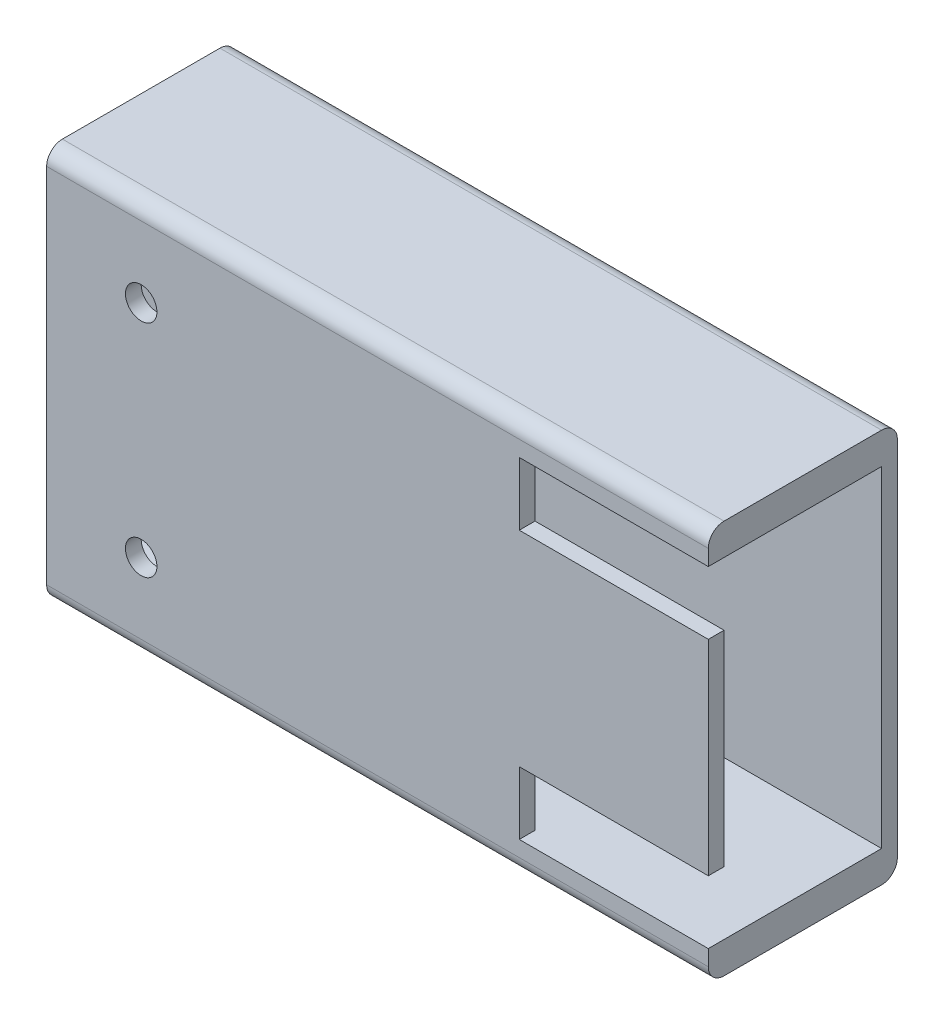
ISO-10303-21;
HEADER;
FILE_DESCRIPTION(('STEP AP214'),'2;1');
FILE_NAME('part.step','',(''),(''),'','','');
FILE_SCHEMA(('AUTOMOTIVE_DESIGN { 1 0 10303 214 1 1 1 1 }'));
ENDSEC;
DATA;
#1=APPLICATION_CONTEXT('core data for automotive mechanical design processes');
#2=APPLICATION_PROTOCOL_DEFINITION('international standard','automotive_design',2000,#1);
#3=PRODUCT_CONTEXT('',#1,'mechanical');
#4=PRODUCT('Part','Part','',(#3));
#5=PRODUCT_RELATED_PRODUCT_CATEGORY('part','',(#4));
#6=PRODUCT_DEFINITION_FORMATION('','',#4);
#7=PRODUCT_DEFINITION_CONTEXT('part definition',#1,'design');
#8=PRODUCT_DEFINITION('design','',#6,#7);
#9=PRODUCT_DEFINITION_SHAPE('','',#8);
#10=(LENGTH_UNIT() NAMED_UNIT(*) SI_UNIT(.MILLI.,.METRE.));
#11=(NAMED_UNIT(*) PLANE_ANGLE_UNIT() SI_UNIT($,.RADIAN.));
#12=(NAMED_UNIT(*) SI_UNIT($,.STERADIAN.) SOLID_ANGLE_UNIT());
#13=UNCERTAINTY_MEASURE_WITH_UNIT(LENGTH_MEASURE(1.E-05),#10,'distance_accuracy_value','');
#14=(GEOMETRIC_REPRESENTATION_CONTEXT(3) GLOBAL_UNCERTAINTY_ASSIGNED_CONTEXT((#13)) GLOBAL_UNIT_ASSIGNED_CONTEXT((#10,
#11,#12)) REPRESENTATION_CONTEXT('',''));
#15=CARTESIAN_POINT('',(0.,0.,0.));
#16=DIRECTION('',(0.,0.,1.));
#17=DIRECTION('',(1.,0.,0.));
#18=AXIS2_PLACEMENT_3D('',#15,#16,#17);
#19=CARTESIAN_POINT('',(21.,12.5,12.));
#20=DIRECTION('',(-1.,0.,0.));
#21=DIRECTION('',(0.,0.,1.));
#22=AXIS2_PLACEMENT_3D('',#19,#20,#21);
#23=PLANE('',#22);
#24=DIRECTION('',(0.,0.,-1.));
#25=VECTOR('',#24,1.);
#26=CARTESIAN_POINT('',(21.,-12.5,12.));
#27=LINE('',#26,#25);
#28=CARTESIAN_POINT('',(21.,-12.5,11.));
#29=VERTEX_POINT('',#28);
#30=CARTESIAN_POINT('',(21.,-12.5,1.));
#31=VERTEX_POINT('',#30);
#32=EDGE_CURVE('E250',#29,#31,#27,.T.);
#33=ORIENTED_EDGE('',*,*,#32,.T.);
#34=CARTESIAN_POINT('',(21.,-11.5,1.));
#35=DIRECTION('',(-1.,0.,0.));
#36=DIRECTION('',(0.,0.,1.));
#37=AXIS2_PLACEMENT_3D('',#34,#35,#36);
#38=CIRCLE('',#37,1.);
#39=CARTESIAN_POINT('',(21.,-11.5,0.));
#40=VERTEX_POINT('',#39);
#41=EDGE_CURVE('E309',#31,#40,#38,.F.);
#42=ORIENTED_EDGE('',*,*,#41,.T.);
#43=DIRECTION('',(0.,1.,0.));
#44=VECTOR('',#43,1.);
#45=CARTESIAN_POINT('',(21.,12.5,0.));
#46=LINE('',#45,#44);
#47=CARTESIAN_POINT('',(21.,11.5,0.));
#48=VERTEX_POINT('',#47);
#49=EDGE_CURVE('E242',#40,#48,#46,.T.);
#50=ORIENTED_EDGE('',*,*,#49,.T.);
#51=CARTESIAN_POINT('',(21.,11.5,1.));
#52=DIRECTION('',(-1.,0.,0.));
#53=DIRECTION('',(0.,0.,1.));
#54=AXIS2_PLACEMENT_3D('',#51,#52,#53);
#55=CIRCLE('',#54,1.);
#56=CARTESIAN_POINT('',(21.,12.5,1.));
#57=VERTEX_POINT('',#56);
#58=EDGE_CURVE('E303',#48,#57,#55,.F.);
#59=ORIENTED_EDGE('',*,*,#58,.T.);
#60=DIRECTION('',(0.,0.,-1.));
#61=VECTOR('',#60,1.);
#62=CARTESIAN_POINT('',(21.,12.5,12.));
#63=LINE('',#62,#61);
#64=CARTESIAN_POINT('',(21.,12.5,11.));
#65=VERTEX_POINT('',#64);
#66=EDGE_CURVE('E232',#65,#57,#63,.T.);
#67=ORIENTED_EDGE('',*,*,#66,.F.);
#68=CARTESIAN_POINT('',(21.,11.5,11.));
#69=DIRECTION('',(-1.,0.,0.));
#70=DIRECTION('',(0.,0.,1.));
#71=AXIS2_PLACEMENT_3D('',#68,#69,#70);
#72=CIRCLE('',#71,1.);
#73=CARTESIAN_POINT('',(21.,11.5,12.));
#74=VERTEX_POINT('',#73);
#75=EDGE_CURVE('E300',#65,#74,#72,.F.);
#76=ORIENTED_EDGE('',*,*,#75,.T.);
#77=DIRECTION('',(0.,1.,0.));
#78=VECTOR('',#77,1.);
#79=CARTESIAN_POINT('',(21.,12.5,12.));
#80=LINE('',#79,#78);
#81=CARTESIAN_POINT('',(21.,10.5,12.));
#82=VERTEX_POINT('',#81);
#83=EDGE_CURVE('E228',#82,#74,#80,.T.);
#84=ORIENTED_EDGE('',*,*,#83,.F.);
#85=DIRECTION('',(0.,0.,1.));
#86=VECTOR('',#85,1.);
#87=CARTESIAN_POINT('',(21.,10.5,11.));
#88=LINE('',#87,#86);
#89=CARTESIAN_POINT('',(21.,10.5,1.));
#90=VERTEX_POINT('',#89);
#91=EDGE_CURVE('E384',#90,#82,#88,.T.);
#92=ORIENTED_EDGE('',*,*,#91,.F.);
#93=DIRECTION('',(0.,1.,0.));
#94=VECTOR('',#93,1.);
#95=CARTESIAN_POINT('',(21.,10.5,1.));
#96=LINE('',#95,#94);
#97=CARTESIAN_POINT('',(21.,-10.5,0.999999999999998));
#98=VERTEX_POINT('',#97);
#99=EDGE_CURVE('E386',#98,#90,#96,.T.);
#100=ORIENTED_EDGE('',*,*,#99,.F.);
#101=DIRECTION('',(0.,0.,-1.));
#102=VECTOR('',#101,1.);
#103=CARTESIAN_POINT('',(21.,-10.5,11.));
#104=LINE('',#103,#102);
#105=CARTESIAN_POINT('',(21.,-10.5,12.));
#106=VERTEX_POINT('',#105);
#107=EDGE_CURVE('E390',#106,#98,#104,.T.);
#108=ORIENTED_EDGE('',*,*,#107,.F.);
#109=CARTESIAN_POINT('',(21.,-11.5,12.));
#110=VERTEX_POINT('',#109);
#111=EDGE_CURVE('E227',#110,#106,#80,.T.);
#112=ORIENTED_EDGE('',*,*,#111,.F.);
#113=CARTESIAN_POINT('',(21.,-11.5,11.));
#114=DIRECTION('',(-1.,0.,0.));
#115=DIRECTION('',(0.,0.,1.));
#116=AXIS2_PLACEMENT_3D('',#113,#114,#115);
#117=CIRCLE('',#116,1.);
#118=EDGE_CURVE('E306',#110,#29,#117,.F.);
#119=ORIENTED_EDGE('',*,*,#118,.T.);
#120=EDGE_LOOP('',(#33,#42,#50,#59,#67,#76,#84,#92,#100,#108,#112,#119));
#121=FACE_BOUND('',#120,.T.);
#122=ADVANCED_FACE('F45',(#121),#23,.F.);
#123=CARTESIAN_POINT('',(-21.,12.5,12.));
#124=DIRECTION('',(0.,-1.,0.));
#125=DIRECTION('',(0.,0.,-1.));
#126=AXIS2_PLACEMENT_3D('',#123,#124,#125);
#127=PLANE('',#126);
#128=ORIENTED_EDGE('',*,*,#66,.T.);
#129=DIRECTION('',(-1.,0.,0.));
#130=VECTOR('',#129,1.);
#131=CARTESIAN_POINT('',(-21.,12.5,1.));
#132=LINE('',#131,#130);
#133=CARTESIAN_POINT('',(-21.,12.5,1.));
#134=VERTEX_POINT('',#133);
#135=EDGE_CURVE('E11',#57,#134,#132,.T.);
#136=ORIENTED_EDGE('',*,*,#135,.T.);
#137=DIRECTION('',(0.,0.,-1.));
#138=VECTOR('',#137,1.);
#139=CARTESIAN_POINT('',(-21.,12.5,12.));
#140=LINE('',#139,#138);
#141=CARTESIAN_POINT('',(-21.,12.5,11.));
#142=VERTEX_POINT('',#141);
#143=EDGE_CURVE('E258',#142,#134,#140,.T.);
#144=ORIENTED_EDGE('',*,*,#143,.F.);
#145=DIRECTION('',(-1.,0.,0.));
#146=VECTOR('',#145,1.);
#147=CARTESIAN_POINT('',(-21.,12.5,11.));
#148=LINE('',#147,#146);
#149=EDGE_CURVE('E54',#142,#65,#148,.F.);
#150=ORIENTED_EDGE('',*,*,#149,.T.);
#151=EDGE_LOOP('',(#128,#136,#144,#150));
#152=FACE_BOUND('',#151,.T.);
#153=ADVANCED_FACE('F339',(#152),#127,.F.);
#154=CARTESIAN_POINT('',(-21.,12.5,12.));
#155=DIRECTION('',(1.,0.,0.));
#156=DIRECTION('',(0.,0.,-1.));
#157=AXIS2_PLACEMENT_3D('',#154,#155,#156);
#158=PLANE('',#157);
#159=DIRECTION('',(0.,0.,1.));
#160=VECTOR('',#159,1.);
#161=CARTESIAN_POINT('',(-21.,5.,12.));
#162=LINE('',#161,#160);
#163=CARTESIAN_POINT('',(-21.,5.,6.));
#164=VERTEX_POINT('',#163);
#165=CARTESIAN_POINT('',(-21.,5.,11.));
#166=VERTEX_POINT('',#165);
#167=EDGE_CURVE('E269',#164,#166,#162,.T.);
#168=ORIENTED_EDGE('',*,*,#167,.T.);
#169=DIRECTION('',(0.,-1.,0.));
#170=VECTOR('',#169,1.);
#171=CARTESIAN_POINT('',(-21.,12.5,11.));
#172=LINE('',#171,#170);
#173=CARTESIAN_POINT('',(-21.,-5.,11.));
#174=VERTEX_POINT('',#173);
#175=EDGE_CURVE('E273',#166,#174,#172,.T.);
#176=ORIENTED_EDGE('',*,*,#175,.T.);
#177=DIRECTION('',(0.,0.,-1.));
#178=VECTOR('',#177,1.);
#179=CARTESIAN_POINT('',(-21.,-5.,12.));
#180=LINE('',#179,#178);
#181=CARTESIAN_POINT('',(-21.,-5.,6.));
#182=VERTEX_POINT('',#181);
#183=EDGE_CURVE('E261',#174,#182,#180,.T.);
#184=ORIENTED_EDGE('',*,*,#183,.T.);
#185=DIRECTION('',(0.,1.,0.));
#186=VECTOR('',#185,1.);
#187=CARTESIAN_POINT('',(-21.,12.5,6.));
#188=LINE('',#187,#186);
#189=EDGE_CURVE('E265',#182,#164,#188,.T.);
#190=ORIENTED_EDGE('',*,*,#189,.T.);
#191=EDGE_LOOP('',(#168,#176,#184,#190));
#192=FACE_BOUND('',#191,.T.);
#193=DIRECTION('',(0.,-1.,0.));
#194=VECTOR('',#193,1.);
#195=CARTESIAN_POINT('',(-21.,12.5,0.));
#196=LINE('',#195,#194);
#197=CARTESIAN_POINT('',(-21.,11.5,0.));
#198=VERTEX_POINT('',#197);
#199=CARTESIAN_POINT('',(-21.,-11.5,0.));
#200=VERTEX_POINT('',#199);
#201=EDGE_CURVE('E238',#198,#200,#196,.T.);
#202=ORIENTED_EDGE('',*,*,#201,.T.);
#203=CARTESIAN_POINT('',(-21.,-11.5,1.));
#204=DIRECTION('',(1.,0.,0.));
#205=DIRECTION('',(0.,0.,-1.));
#206=AXIS2_PLACEMENT_3D('',#203,#204,#205);
#207=CIRCLE('',#206,1.);
#208=CARTESIAN_POINT('',(-21.,-12.5,1.));
#209=VERTEX_POINT('',#208);
#210=EDGE_CURVE('E325',#200,#209,#207,.F.);
#211=ORIENTED_EDGE('',*,*,#210,.T.);
#212=DIRECTION('',(0.,0.,-1.));
#213=VECTOR('',#212,1.);
#214=CARTESIAN_POINT('',(-21.,-12.5,12.));
#215=LINE('',#214,#213);
#216=CARTESIAN_POINT('',(-21.,-12.5,11.));
#217=VERTEX_POINT('',#216);
#218=EDGE_CURVE('E254',#217,#209,#215,.T.);
#219=ORIENTED_EDGE('',*,*,#218,.F.);
#220=CARTESIAN_POINT('',(-21.,-11.5,11.));
#221=DIRECTION('',(1.,0.,0.));
#222=DIRECTION('',(0.,0.,-1.));
#223=AXIS2_PLACEMENT_3D('',#220,#221,#222);
#224=CIRCLE('',#223,1.);
#225=CARTESIAN_POINT('',(-21.,-11.5,12.));
#226=VERTEX_POINT('',#225);
#227=EDGE_CURVE('E322',#217,#226,#224,.F.);
#228=ORIENTED_EDGE('',*,*,#227,.T.);
#229=DIRECTION('',(0.,-1.,0.));
#230=VECTOR('',#229,1.);
#231=CARTESIAN_POINT('',(-21.,12.5,12.));
#232=LINE('',#231,#230);
#233=CARTESIAN_POINT('',(-21.,11.5,12.));
#234=VERTEX_POINT('',#233);
#235=EDGE_CURVE('E234',#234,#226,#232,.T.);
#236=ORIENTED_EDGE('',*,*,#235,.F.);
#237=CARTESIAN_POINT('',(-21.,11.5,11.));
#238=DIRECTION('',(1.,0.,0.));
#239=DIRECTION('',(0.,0.,-1.));
#240=AXIS2_PLACEMENT_3D('',#237,#238,#239);
#241=CIRCLE('',#240,1.);
#242=EDGE_CURVE('E68',#234,#142,#241,.F.);
#243=ORIENTED_EDGE('',*,*,#242,.T.);
#244=ORIENTED_EDGE('',*,*,#143,.T.);
#245=CARTESIAN_POINT('',(-21.,11.5,1.));
#246=DIRECTION('',(1.,0.,0.));
#247=DIRECTION('',(0.,0.,-1.));
#248=AXIS2_PLACEMENT_3D('',#245,#246,#247);
#249=CIRCLE('',#248,1.);
#250=EDGE_CURVE('E61',#134,#198,#249,.F.);
#251=ORIENTED_EDGE('',*,*,#250,.T.);
#252=EDGE_LOOP('',(#202,#211,#219,#228,#236,#243,#244,#251));
#253=FACE_BOUND('',#252,.T.);
#254=ADVANCED_FACE('F348',(#192,#253),#158,.F.);
#255=CARTESIAN_POINT('',(-21.,-12.5,12.));
#256=DIRECTION('',(0.,1.,0.));
#257=DIRECTION('',(-1.,0.,0.));
#258=AXIS2_PLACEMENT_3D('',#255,#256,#257);
#259=PLANE('',#258);
#260=ORIENTED_EDGE('',*,*,#218,.T.);
#261=DIRECTION('',(1.,0.,0.));
#262=VECTOR('',#261,1.);
#263=CARTESIAN_POINT('',(21.,-12.5,1.));
#264=LINE('',#263,#262);
#265=EDGE_CURVE('E296',#209,#31,#264,.T.);
#266=ORIENTED_EDGE('',*,*,#265,.T.);
#267=ORIENTED_EDGE('',*,*,#32,.F.);
#268=DIRECTION('',(1.,0.,0.));
#269=VECTOR('',#268,1.);
#270=CARTESIAN_POINT('',(-21.,-12.5,11.));
#271=LINE('',#270,#269);
#272=EDGE_CURVE('E283',#29,#217,#271,.F.);
#273=ORIENTED_EDGE('',*,*,#272,.T.);
#274=EDGE_LOOP('',(#260,#266,#267,#273));
#275=FACE_BOUND('',#274,.T.);
#276=ADVANCED_FACE('F478',(#275),#259,.F.);
#277=CARTESIAN_POINT('',(21.,-6.5,12.));
#278=VERTEX_POINT('',#277);
#279=CARTESIAN_POINT('',(21.,6.5,12.));
#280=VERTEX_POINT('',#279);
#281=EDGE_CURVE('E216',#278,#280,#80,.T.);
#282=ORIENTED_EDGE('',*,*,#281,.F.);
#283=DIRECTION('',(0.,0.,1.));
#284=VECTOR('',#283,1.);
#285=CARTESIAN_POINT('',(21.,-6.5,2.));
#286=LINE('',#285,#284);
#287=CARTESIAN_POINT('',(21.,-6.5,11.));
#288=VERTEX_POINT('',#287);
#289=EDGE_CURVE('E196',#288,#278,#286,.T.);
#290=ORIENTED_EDGE('',*,*,#289,.F.);
#291=DIRECTION('',(0.,-1.,0.));
#292=VECTOR('',#291,1.);
#293=CARTESIAN_POINT('',(21.,10.5,11.));
#294=LINE('',#293,#292);
#295=CARTESIAN_POINT('',(21.,6.5,11.));
#296=VERTEX_POINT('',#295);
#297=EDGE_CURVE('E393',#296,#288,#294,.T.);
#298=ORIENTED_EDGE('',*,*,#297,.F.);
#299=DIRECTION('',(0.,0.,1.));
#300=VECTOR('',#299,1.);
#301=CARTESIAN_POINT('',(21.,6.5,2.));
#302=LINE('',#301,#300);
#303=EDGE_CURVE('E225',#296,#280,#302,.T.);
#304=ORIENTED_EDGE('',*,*,#303,.T.);
#305=EDGE_LOOP('',(#282,#290,#298,#304));
#306=FACE_BOUND('',#305,.T.);
#307=ADVANCED_FACE('F224',(#306),#23,.F.);
#308=CARTESIAN_POINT('',(0.,0.,12.));
#309=DIRECTION('',(0.,0.,-1.));
#310=DIRECTION('',(-1.,0.,0.));
#311=AXIS2_PLACEMENT_3D('',#308,#309,#310);
#312=PLANE('',#311);
#313=CARTESIAN_POINT('',(-15.,7.,12.));
#314=DIRECTION('',(0.,0.,-1.));
#315=DIRECTION('',(-1.,0.,0.));
#316=AXIS2_PLACEMENT_3D('',#313,#314,#315);
#317=CIRCLE('',#316,1.);
#318=CARTESIAN_POINT('',(-16.,7.,12.));
#319=VERTEX_POINT('',#318);
#320=EDGE_CURVE('E293',#319,#319,#317,.F.);
#321=ORIENTED_EDGE('',*,*,#320,.F.);
#322=EDGE_LOOP('',(#321));
#323=FACE_BOUND('',#322,.T.);
#324=CARTESIAN_POINT('',(-15.,-7.,12.));
#325=DIRECTION('',(0.,0.,-1.));
#326=DIRECTION('',(-1.,0.,0.));
#327=AXIS2_PLACEMENT_3D('',#324,#325,#326);
#328=CIRCLE('',#327,1.);
#329=CARTESIAN_POINT('',(-16.,-7.,12.));
#330=VERTEX_POINT('',#329);
#331=EDGE_CURVE('E288',#330,#330,#328,.F.);
#332=ORIENTED_EDGE('',*,*,#331,.F.);
#333=EDGE_LOOP('',(#332));
#334=FACE_BOUND('',#333,.T.);
#335=ORIENTED_EDGE('',*,*,#235,.T.);
#336=DIRECTION('',(1.,0.,0.));
#337=VECTOR('',#336,1.);
#338=CARTESIAN_POINT('',(0.,-11.5,12.));
#339=LINE('',#338,#337);
#340=EDGE_CURVE('E332',#226,#110,#339,.T.);
#341=ORIENTED_EDGE('',*,*,#340,.T.);
#342=ORIENTED_EDGE('',*,*,#111,.T.);
#343=DIRECTION('',(1.,0.,0.));
#344=VECTOR('',#343,1.);
#345=CARTESIAN_POINT('',(21.,-10.5,12.));
#346=LINE('',#345,#344);
#347=CARTESIAN_POINT('',(9.,-10.5,12.));
#348=VERTEX_POINT('',#347);
#349=EDGE_CURVE('E209',#348,#106,#346,.T.);
#350=ORIENTED_EDGE('',*,*,#349,.F.);
#351=DIRECTION('',(0.,-1.,0.));
#352=VECTOR('',#351,1.);
#353=CARTESIAN_POINT('',(9.,-10.5,12.));
#354=LINE('',#353,#352);
#355=CARTESIAN_POINT('',(9.,-6.5,12.));
#356=VERTEX_POINT('',#355);
#357=EDGE_CURVE('E219',#356,#348,#354,.T.);
#358=ORIENTED_EDGE('',*,*,#357,.F.);
#359=DIRECTION('',(-1.,0.,0.));
#360=VECTOR('',#359,1.);
#361=CARTESIAN_POINT('',(21.,-6.5,12.));
#362=LINE('',#361,#360);
#363=EDGE_CURVE('E199',#278,#356,#362,.T.);
#364=ORIENTED_EDGE('',*,*,#363,.F.);
#365=ORIENTED_EDGE('',*,*,#281,.T.);
#366=DIRECTION('',(1.,0.,0.));
#367=VECTOR('',#366,1.);
#368=CARTESIAN_POINT('',(21.,6.5,12.));
#369=LINE('',#368,#367);
#370=CARTESIAN_POINT('',(9.,6.5,12.));
#371=VERTEX_POINT('',#370);
#372=EDGE_CURVE('E445',#371,#280,#369,.T.);
#373=ORIENTED_EDGE('',*,*,#372,.F.);
#374=DIRECTION('',(0.,-1.,0.));
#375=VECTOR('',#374,1.);
#376=CARTESIAN_POINT('',(9.,10.5,12.));
#377=LINE('',#376,#375);
#378=CARTESIAN_POINT('',(9.,10.5,12.));
#379=VERTEX_POINT('',#378);
#380=EDGE_CURVE('E441',#379,#371,#377,.T.);
#381=ORIENTED_EDGE('',*,*,#380,.F.);
#382=DIRECTION('',(-1.,0.,0.));
#383=VECTOR('',#382,1.);
#384=CARTESIAN_POINT('',(21.,10.5,12.));
#385=LINE('',#384,#383);
#386=EDGE_CURVE('E221',#82,#379,#385,.T.);
#387=ORIENTED_EDGE('',*,*,#386,.F.);
#388=ORIENTED_EDGE('',*,*,#83,.T.);
#389=DIRECTION('',(-1.,0.,0.));
#390=VECTOR('',#389,1.);
#391=CARTESIAN_POINT('',(0.,11.5,12.));
#392=LINE('',#391,#390);
#393=EDGE_CURVE('E328',#74,#234,#392,.T.);
#394=ORIENTED_EDGE('',*,*,#393,.T.);
#395=EDGE_LOOP('',(#335,#341,#342,#350,#358,#364,#365,#373,#381,#387,#388,#394));
#396=FACE_BOUND('',#395,.T.);
#397=ADVANCED_FACE('F214',(#323,#334,#396),#312,.F.);
#398=CARTESIAN_POINT('',(0.,0.,0.));
#399=DIRECTION('',(0.,0.,-1.));
#400=DIRECTION('',(-1.,0.,0.));
#401=AXIS2_PLACEMENT_3D('',#398,#399,#400);
#402=PLANE('',#401);
#403=ORIENTED_EDGE('',*,*,#49,.F.);
#404=DIRECTION('',(1.,0.,0.));
#405=VECTOR('',#404,1.);
#406=CARTESIAN_POINT('',(-21.,-11.5,0.));
#407=LINE('',#406,#405);
#408=EDGE_CURVE('E315',#40,#200,#407,.F.);
#409=ORIENTED_EDGE('',*,*,#408,.T.);
#410=ORIENTED_EDGE('',*,*,#201,.F.);
#411=DIRECTION('',(-1.,0.,0.));
#412=VECTOR('',#411,1.);
#413=CARTESIAN_POINT('',(21.,11.5,0.));
#414=LINE('',#413,#412);
#415=EDGE_CURVE('E312',#198,#48,#414,.F.);
#416=ORIENTED_EDGE('',*,*,#415,.T.);
#417=EDGE_LOOP('',(#403,#409,#410,#416));
#418=FACE_BOUND('',#417,.T.);
#419=ADVANCED_FACE('F467',(#418),#402,.T.);
#420=CARTESIAN_POINT('',(-20.,10.5,11.));
#421=DIRECTION('',(0.,0.,1.));
#422=DIRECTION('',(1.,0.,0.));
#423=AXIS2_PLACEMENT_3D('',#420,#421,#422);
#424=PLANE('',#423);
#425=CARTESIAN_POINT('',(-15.,7.,11.));
#426=DIRECTION('',(0.,0.,1.));
#427=DIRECTION('',(1.,0.,0.));
#428=AXIS2_PLACEMENT_3D('',#425,#426,#427);
#429=CIRCLE('',#428,1.);
#430=CARTESIAN_POINT('',(-14.,7.,11.));
#431=VERTEX_POINT('',#430);
#432=EDGE_CURVE('E289',#431,#431,#429,.F.);
#433=ORIENTED_EDGE('',*,*,#432,.F.);
#434=EDGE_LOOP('',(#433));
#435=FACE_BOUND('',#434,.T.);
#436=CARTESIAN_POINT('',(-15.,-7.,11.));
#437=DIRECTION('',(0.,0.,1.));
#438=DIRECTION('',(1.,0.,0.));
#439=AXIS2_PLACEMENT_3D('',#436,#437,#438);
#440=CIRCLE('',#439,1.);
#441=CARTESIAN_POINT('',(-14.,-7.,11.));
#442=VERTEX_POINT('',#441);
#443=EDGE_CURVE('E284',#442,#442,#440,.F.);
#444=ORIENTED_EDGE('',*,*,#443,.F.);
#445=EDGE_LOOP('',(#444));
#446=FACE_BOUND('',#445,.T.);
#447=DIRECTION('',(-1.,0.,0.));
#448=VECTOR('',#447,1.);
#449=CARTESIAN_POINT('',(-20.,-6.5,11.));
#450=LINE('',#449,#448);
#451=CARTESIAN_POINT('',(9.,-6.5,11.));
#452=VERTEX_POINT('',#451);
#453=EDGE_CURVE('E202',#288,#452,#450,.T.);
#454=ORIENTED_EDGE('',*,*,#453,.T.);
#455=DIRECTION('',(0.,-1.,0.));
#456=VECTOR('',#455,1.);
#457=CARTESIAN_POINT('',(9.,10.5,11.));
#458=LINE('',#457,#456);
#459=CARTESIAN_POINT('',(9.,-10.5,11.));
#460=VERTEX_POINT('',#459);
#461=EDGE_CURVE('E424',#452,#460,#458,.T.);
#462=ORIENTED_EDGE('',*,*,#461,.T.);
#463=DIRECTION('',(1.,0.,0.));
#464=VECTOR('',#463,1.);
#465=CARTESIAN_POINT('',(-20.,-10.5,11.));
#466=LINE('',#465,#464);
#467=CARTESIAN_POINT('',(-20.,-10.5,11.));
#468=VERTEX_POINT('',#467);
#469=EDGE_CURVE('E362',#468,#460,#466,.T.);
#470=ORIENTED_EDGE('',*,*,#469,.F.);
#471=DIRECTION('',(0.,-1.,0.));
#472=VECTOR('',#471,1.);
#473=CARTESIAN_POINT('',(-20.,10.5,11.));
#474=LINE('',#473,#472);
#475=CARTESIAN_POINT('',(-20.,-5.,11.));
#476=VERTEX_POINT('',#475);
#477=EDGE_CURVE('E381',#476,#468,#474,.T.);
#478=ORIENTED_EDGE('',*,*,#477,.F.);
#479=DIRECTION('',(1.,0.,0.));
#480=VECTOR('',#479,1.);
#481=CARTESIAN_POINT('',(-30.,-5.,11.));
#482=LINE('',#481,#480);
#483=EDGE_CURVE('E406',#174,#476,#482,.T.);
#484=ORIENTED_EDGE('',*,*,#483,.F.);
#485=ORIENTED_EDGE('',*,*,#175,.F.);
#486=DIRECTION('',(1.,0.,0.));
#487=VECTOR('',#486,1.);
#488=CARTESIAN_POINT('',(-30.,5.,11.));
#489=LINE('',#488,#487);
#490=CARTESIAN_POINT('',(-20.,5.,11.));
#491=VERTEX_POINT('',#490);
#492=EDGE_CURVE('E396',#166,#491,#489,.T.);
#493=ORIENTED_EDGE('',*,*,#492,.T.);
#494=CARTESIAN_POINT('',(-20.,10.5,11.));
#495=VERTEX_POINT('',#494);
#496=EDGE_CURVE('E377',#495,#491,#474,.T.);
#497=ORIENTED_EDGE('',*,*,#496,.F.);
#498=DIRECTION('',(1.,0.,0.));
#499=VECTOR('',#498,1.);
#500=CARTESIAN_POINT('',(-20.,10.5,11.));
#501=LINE('',#500,#499);
#502=CARTESIAN_POINT('',(9.,10.5,11.));
#503=VERTEX_POINT('',#502);
#504=EDGE_CURVE('E243',#495,#503,#501,.T.);
#505=ORIENTED_EDGE('',*,*,#504,.T.);
#506=DIRECTION('',(0.,-1.,0.));
#507=VECTOR('',#506,1.);
#508=CARTESIAN_POINT('',(9.,10.5,11.));
#509=LINE('',#508,#507);
#510=CARTESIAN_POINT('',(9.,6.5,11.));
#511=VERTEX_POINT('',#510);
#512=EDGE_CURVE('E420',#503,#511,#509,.T.);
#513=ORIENTED_EDGE('',*,*,#512,.T.);
#514=DIRECTION('',(1.,0.,0.));
#515=VECTOR('',#514,1.);
#516=CARTESIAN_POINT('',(-20.,6.5,11.));
#517=LINE('',#516,#515);
#518=EDGE_CURVE('E277',#511,#296,#517,.T.);
#519=ORIENTED_EDGE('',*,*,#518,.T.);
#520=ORIENTED_EDGE('',*,*,#297,.T.);
#521=EDGE_LOOP('',(#454,#462,#470,#478,#484,#485,#493,#497,#505,#513,#519,#520));
#522=FACE_BOUND('',#521,.T.);
#523=ADVANCED_FACE('F474',(#435,#446,#522),#424,.F.);
#524=CARTESIAN_POINT('',(-20.,10.5,11.));
#525=DIRECTION('',(0.,1.,0.));
#526=DIRECTION('',(0.,0.,1.));
#527=AXIS2_PLACEMENT_3D('',#524,#525,#526);
#528=PLANE('',#527);
#529=ORIENTED_EDGE('',*,*,#91,.T.);
#530=ORIENTED_EDGE('',*,*,#386,.T.);
#531=DIRECTION('',(0.,0.,1.));
#532=VECTOR('',#531,1.);
#533=CARTESIAN_POINT('',(9.,10.5,2.));
#534=LINE('',#533,#532);
#535=EDGE_CURVE('E448',#503,#379,#534,.T.);
#536=ORIENTED_EDGE('',*,*,#535,.F.);
#537=ORIENTED_EDGE('',*,*,#504,.F.);
#538=DIRECTION('',(0.,0.,1.));
#539=VECTOR('',#538,1.);
#540=CARTESIAN_POINT('',(-20.,10.5,11.));
#541=LINE('',#540,#539);
#542=CARTESIAN_POINT('',(-20.,10.5,1.));
#543=VERTEX_POINT('',#542);
#544=EDGE_CURVE('E366',#543,#495,#541,.T.);
#545=ORIENTED_EDGE('',*,*,#544,.F.);
#546=DIRECTION('',(1.,0.,0.));
#547=VECTOR('',#546,1.);
#548=CARTESIAN_POINT('',(-20.,10.5,1.));
#549=LINE('',#548,#547);
#550=EDGE_CURVE('E355',#543,#90,#549,.T.);
#551=ORIENTED_EDGE('',*,*,#550,.T.);
#552=EDGE_LOOP('',(#529,#530,#536,#537,#545,#551));
#553=FACE_BOUND('',#552,.T.);
#554=ADVANCED_FACE('F534',(#553),#528,.F.);
#555=CARTESIAN_POINT('',(-20.,10.5,1.));
#556=DIRECTION('',(0.,0.,-1.));
#557=DIRECTION('',(0.,1.,0.));
#558=AXIS2_PLACEMENT_3D('',#555,#556,#557);
#559=PLANE('',#558);
#560=ORIENTED_EDGE('',*,*,#99,.T.);
#561=ORIENTED_EDGE('',*,*,#550,.F.);
#562=DIRECTION('',(0.,1.,0.));
#563=VECTOR('',#562,1.);
#564=CARTESIAN_POINT('',(-20.,10.5,1.));
#565=LINE('',#564,#563);
#566=CARTESIAN_POINT('',(-20.,-10.5,0.999999999999998));
#567=VERTEX_POINT('',#566);
#568=EDGE_CURVE('E369',#567,#543,#565,.T.);
#569=ORIENTED_EDGE('',*,*,#568,.F.);
#570=DIRECTION('',(1.,0.,0.));
#571=VECTOR('',#570,1.);
#572=CARTESIAN_POINT('',(-20.,-10.5,0.999999999999998));
#573=LINE('',#572,#571);
#574=EDGE_CURVE('E358',#567,#98,#573,.T.);
#575=ORIENTED_EDGE('',*,*,#574,.T.);
#576=EDGE_LOOP('',(#560,#561,#569,#575));
#577=FACE_BOUND('',#576,.T.);
#578=ADVANCED_FACE('F538',(#577),#559,.F.);
#579=CARTESIAN_POINT('',(-20.,-10.5,11.));
#580=DIRECTION('',(0.,-1.,0.));
#581=DIRECTION('',(0.,0.,-1.));
#582=AXIS2_PLACEMENT_3D('',#579,#580,#581);
#583=PLANE('',#582);
#584=ORIENTED_EDGE('',*,*,#469,.T.);
#585=DIRECTION('',(0.,0.,1.));
#586=VECTOR('',#585,1.);
#587=CARTESIAN_POINT('',(9.,-10.5,2.));
#588=LINE('',#587,#586);
#589=EDGE_CURVE('E428',#460,#348,#588,.T.);
#590=ORIENTED_EDGE('',*,*,#589,.T.);
#591=ORIENTED_EDGE('',*,*,#349,.T.);
#592=ORIENTED_EDGE('',*,*,#107,.T.);
#593=ORIENTED_EDGE('',*,*,#574,.F.);
#594=DIRECTION('',(0.,0.,-1.));
#595=VECTOR('',#594,1.);
#596=CARTESIAN_POINT('',(-20.,-10.5,11.));
#597=LINE('',#596,#595);
#598=EDGE_CURVE('E373',#468,#567,#597,.T.);
#599=ORIENTED_EDGE('',*,*,#598,.F.);
#600=EDGE_LOOP('',(#584,#590,#591,#592,#593,#599));
#601=FACE_BOUND('',#600,.T.);
#602=ADVANCED_FACE('F519',(#601),#583,.F.);
#603=CARTESIAN_POINT('',(-20.,0.,0.));
#604=DIRECTION('',(1.,0.,0.));
#605=DIRECTION('',(0.,0.,-1.));
#606=AXIS2_PLACEMENT_3D('',#603,#604,#605);
#607=PLANE('',#606);
#608=DIRECTION('',(0.,0.,-1.));
#609=VECTOR('',#608,1.);
#610=CARTESIAN_POINT('',(-20.,-5.,11.));
#611=LINE('',#610,#609);
#612=CARTESIAN_POINT('',(-20.,-5.,6.));
#613=VERTEX_POINT('',#612);
#614=EDGE_CURVE('E416',#476,#613,#611,.T.);
#615=ORIENTED_EDGE('',*,*,#614,.F.);
#616=ORIENTED_EDGE('',*,*,#477,.T.);
#617=ORIENTED_EDGE('',*,*,#598,.T.);
#618=ORIENTED_EDGE('',*,*,#568,.T.);
#619=ORIENTED_EDGE('',*,*,#544,.T.);
#620=ORIENTED_EDGE('',*,*,#496,.T.);
#621=DIRECTION('',(0.,0.,1.));
#622=VECTOR('',#621,1.);
#623=CARTESIAN_POINT('',(-20.,5.,11.));
#624=LINE('',#623,#622);
#625=CARTESIAN_POINT('',(-20.,5.,6.));
#626=VERTEX_POINT('',#625);
#627=EDGE_CURVE('E409',#626,#491,#624,.T.);
#628=ORIENTED_EDGE('',*,*,#627,.F.);
#629=DIRECTION('',(0.,1.,0.));
#630=VECTOR('',#629,1.);
#631=CARTESIAN_POINT('',(-20.,5.,6.));
#632=LINE('',#631,#630);
#633=EDGE_CURVE('E413',#613,#626,#632,.T.);
#634=ORIENTED_EDGE('',*,*,#633,.F.);
#635=EDGE_LOOP('',(#615,#616,#617,#618,#619,#620,#628,#634));
#636=FACE_BOUND('',#635,.T.);
#637=ADVANCED_FACE('F541',(#636),#607,.T.);
#638=CARTESIAN_POINT('',(-30.,5.,11.));
#639=DIRECTION('',(0.,1.,0.));
#640=DIRECTION('',(0.,0.,1.));
#641=AXIS2_PLACEMENT_3D('',#638,#639,#640);
#642=PLANE('',#641);
#643=DIRECTION('',(1.,0.,0.));
#644=VECTOR('',#643,1.);
#645=CARTESIAN_POINT('',(-30.,5.,6.));
#646=LINE('',#645,#644);
#647=EDGE_CURVE('E399',#164,#626,#646,.T.);
#648=ORIENTED_EDGE('',*,*,#647,.T.);
#649=ORIENTED_EDGE('',*,*,#627,.T.);
#650=ORIENTED_EDGE('',*,*,#492,.F.);
#651=ORIENTED_EDGE('',*,*,#167,.F.);
#652=EDGE_LOOP('',(#648,#649,#650,#651));
#653=FACE_BOUND('',#652,.T.);
#654=ADVANCED_FACE('F550',(#653),#642,.F.);
#655=CARTESIAN_POINT('',(-30.,5.,6.));
#656=DIRECTION('',(0.,0.,-1.));
#657=DIRECTION('',(0.,1.,0.));
#658=AXIS2_PLACEMENT_3D('',#655,#656,#657);
#659=PLANE('',#658);
#660=DIRECTION('',(1.,0.,0.));
#661=VECTOR('',#660,1.);
#662=CARTESIAN_POINT('',(-30.,-5.,6.));
#663=LINE('',#662,#661);
#664=EDGE_CURVE('E403',#182,#613,#663,.T.);
#665=ORIENTED_EDGE('',*,*,#664,.T.);
#666=ORIENTED_EDGE('',*,*,#633,.T.);
#667=ORIENTED_EDGE('',*,*,#647,.F.);
#668=ORIENTED_EDGE('',*,*,#189,.F.);
#669=EDGE_LOOP('',(#665,#666,#667,#668));
#670=FACE_BOUND('',#669,.T.);
#671=ADVANCED_FACE('F553',(#670),#659,.F.);
#672=CARTESIAN_POINT('',(-30.,-5.,11.));
#673=DIRECTION('',(0.,-1.,0.));
#674=DIRECTION('',(0.,0.,-1.));
#675=AXIS2_PLACEMENT_3D('',#672,#673,#674);
#676=PLANE('',#675);
#677=ORIENTED_EDGE('',*,*,#483,.T.);
#678=ORIENTED_EDGE('',*,*,#614,.T.);
#679=ORIENTED_EDGE('',*,*,#664,.F.);
#680=ORIENTED_EDGE('',*,*,#183,.F.);
#681=EDGE_LOOP('',(#677,#678,#679,#680));
#682=FACE_BOUND('',#681,.T.);
#683=ADVANCED_FACE('F555',(#682),#676,.F.);
#684=CARTESIAN_POINT('',(21.,6.5,2.));
#685=DIRECTION('',(0.,-1.,0.));
#686=DIRECTION('',(0.,0.,-1.));
#687=AXIS2_PLACEMENT_3D('',#684,#685,#686);
#688=PLANE('',#687);
#689=DIRECTION('',(0.,0.,1.));
#690=VECTOR('',#689,1.);
#691=CARTESIAN_POINT('',(9.,6.5,2.));
#692=LINE('',#691,#690);
#693=EDGE_CURVE('E451',#511,#371,#692,.T.);
#694=ORIENTED_EDGE('',*,*,#693,.T.);
#695=ORIENTED_EDGE('',*,*,#372,.T.);
#696=ORIENTED_EDGE('',*,*,#303,.F.);
#697=ORIENTED_EDGE('',*,*,#518,.F.);
#698=EDGE_LOOP('',(#694,#695,#696,#697));
#699=FACE_BOUND('',#698,.T.);
#700=ADVANCED_FACE('F528',(#699),#688,.F.);
#701=CARTESIAN_POINT('',(9.,10.5,2.));
#702=DIRECTION('',(-1.,0.,0.));
#703=DIRECTION('',(0.,0.,1.));
#704=AXIS2_PLACEMENT_3D('',#701,#702,#703);
#705=PLANE('',#704);
#706=ORIENTED_EDGE('',*,*,#535,.T.);
#707=ORIENTED_EDGE('',*,*,#380,.T.);
#708=ORIENTED_EDGE('',*,*,#693,.F.);
#709=ORIENTED_EDGE('',*,*,#512,.F.);
#710=EDGE_LOOP('',(#706,#707,#708,#709));
#711=FACE_BOUND('',#710,.T.);
#712=ADVANCED_FACE('F531',(#711),#705,.F.);
#713=CARTESIAN_POINT('',(21.,-6.5,2.));
#714=DIRECTION('',(0.,1.,0.));
#715=DIRECTION('',(0.,0.,1.));
#716=AXIS2_PLACEMENT_3D('',#713,#714,#715);
#717=PLANE('',#716);
#718=ORIENTED_EDGE('',*,*,#289,.T.);
#719=ORIENTED_EDGE('',*,*,#363,.T.);
#720=DIRECTION('',(0.,0.,1.));
#721=VECTOR('',#720,1.);
#722=CARTESIAN_POINT('',(9.,-6.5,2.));
#723=LINE('',#722,#721);
#724=EDGE_CURVE('E208',#452,#356,#723,.T.);
#725=ORIENTED_EDGE('',*,*,#724,.F.);
#726=ORIENTED_EDGE('',*,*,#453,.F.);
#727=EDGE_LOOP('',(#718,#719,#725,#726));
#728=FACE_BOUND('',#727,.T.);
#729=ADVANCED_FACE('F198',(#728),#717,.F.);
#730=CARTESIAN_POINT('',(9.,-10.5,2.));
#731=DIRECTION('',(-1.,0.,0.));
#732=DIRECTION('',(0.,0.,1.));
#733=AXIS2_PLACEMENT_3D('',#730,#731,#732);
#734=PLANE('',#733);
#735=ORIENTED_EDGE('',*,*,#724,.T.);
#736=ORIENTED_EDGE('',*,*,#357,.T.);
#737=ORIENTED_EDGE('',*,*,#589,.F.);
#738=ORIENTED_EDGE('',*,*,#461,.F.);
#739=EDGE_LOOP('',(#735,#736,#737,#738));
#740=FACE_BOUND('',#739,.T.);
#741=ADVANCED_FACE('F524',(#740),#734,.F.);
#742=CARTESIAN_POINT('',(-15.,-7.,22.));
#743=DIRECTION('',(0.,0.,-1.));
#744=DIRECTION('',(-1.,0.,0.));
#745=AXIS2_PLACEMENT_3D('',#742,#743,#744);
#746=CYLINDRICAL_SURFACE('',#745,1.);
#747=ORIENTED_EDGE('',*,*,#443,.T.);
#748=EDGE_LOOP('',(#747));
#749=FACE_BOUND('',#748,.T.);
#750=ORIENTED_EDGE('',*,*,#331,.T.);
#751=EDGE_LOOP('',(#750));
#752=FACE_BOUND('',#751,.T.);
#753=ADVANCED_FACE('F464',(#749,#752),#746,.F.);
#754=CARTESIAN_POINT('',(-15.,7.,22.));
#755=DIRECTION('',(0.,0.,-1.));
#756=DIRECTION('',(-1.,0.,0.));
#757=AXIS2_PLACEMENT_3D('',#754,#755,#756);
#758=CYLINDRICAL_SURFACE('',#757,1.);
#759=ORIENTED_EDGE('',*,*,#432,.T.);
#760=EDGE_LOOP('',(#759));
#761=FACE_BOUND('',#760,.T.);
#762=ORIENTED_EDGE('',*,*,#320,.T.);
#763=EDGE_LOOP('',(#762));
#764=FACE_BOUND('',#763,.T.);
#765=ADVANCED_FACE('F498',(#761,#764),#758,.F.);
#766=CARTESIAN_POINT('',(-21.,-11.5,1.));
#767=DIRECTION('',(-1.,0.,0.));
#768=DIRECTION('',(0.,-1.,0.));
#769=AXIS2_PLACEMENT_3D('',#766,#767,#768);
#770=CYLINDRICAL_SURFACE('',#769,1.);
#771=ORIENTED_EDGE('',*,*,#210,.F.);
#772=ORIENTED_EDGE('',*,*,#408,.F.);
#773=ORIENTED_EDGE('',*,*,#41,.F.);
#774=ORIENTED_EDGE('',*,*,#265,.F.);
#775=EDGE_LOOP('',(#771,#772,#773,#774));
#776=FACE_BOUND('',#775,.T.);
#777=ADVANCED_FACE('F494',(#776),#770,.T.);
#778=CARTESIAN_POINT('',(0.,-11.5,11.));
#779=DIRECTION('',(1.,0.,0.));
#780=DIRECTION('',(0.,1.,0.));
#781=AXIS2_PLACEMENT_3D('',#778,#779,#780);
#782=CYLINDRICAL_SURFACE('',#781,1.);
#783=ORIENTED_EDGE('',*,*,#227,.F.);
#784=ORIENTED_EDGE('',*,*,#272,.F.);
#785=ORIENTED_EDGE('',*,*,#118,.F.);
#786=ORIENTED_EDGE('',*,*,#340,.F.);
#787=EDGE_LOOP('',(#783,#784,#785,#786));
#788=FACE_BOUND('',#787,.T.);
#789=ADVANCED_FACE('F497',(#788),#782,.T.);
#790=CARTESIAN_POINT('',(-21.,11.5,1.));
#791=DIRECTION('',(1.,0.,0.));
#792=DIRECTION('',(0.,0.,-1.));
#793=AXIS2_PLACEMENT_3D('',#790,#791,#792);
#794=CYLINDRICAL_SURFACE('',#793,1.);
#795=ORIENTED_EDGE('',*,*,#58,.F.);
#796=ORIENTED_EDGE('',*,*,#415,.F.);
#797=ORIENTED_EDGE('',*,*,#250,.F.);
#798=ORIENTED_EDGE('',*,*,#135,.F.);
#799=EDGE_LOOP('',(#795,#796,#797,#798));
#800=FACE_BOUND('',#799,.T.);
#801=ADVANCED_FACE('F501',(#800),#794,.T.);
#802=CARTESIAN_POINT('',(0.,11.5,11.));
#803=DIRECTION('',(-1.,0.,0.));
#804=DIRECTION('',(0.,0.,1.));
#805=AXIS2_PLACEMENT_3D('',#802,#803,#804);
#806=CYLINDRICAL_SURFACE('',#805,1.);
#807=ORIENTED_EDGE('',*,*,#75,.F.);
#808=ORIENTED_EDGE('',*,*,#149,.F.);
#809=ORIENTED_EDGE('',*,*,#242,.F.);
#810=ORIENTED_EDGE('',*,*,#393,.F.);
#811=EDGE_LOOP('',(#807,#808,#809,#810));
#812=FACE_BOUND('',#811,.T.);
#813=ADVANCED_FACE('F47',(#812),#806,.T.);
#814=CLOSED_SHELL('',(#122,#153,#254,#276,#307,#397,#419,#523,#554,#578,#602,#637,#654,#671,
#683,#700,#712,#729,#741,#753,#765,#777,#789,#801,#813));
#815=MANIFOLD_SOLID_BREP('B2',#814);
#816=ADVANCED_BREP_SHAPE_REPRESENTATION('',(#18,#815),#14);
#817=SHAPE_DEFINITION_REPRESENTATION(#9,#816);
ENDSEC;
END-ISO-10303-21;
